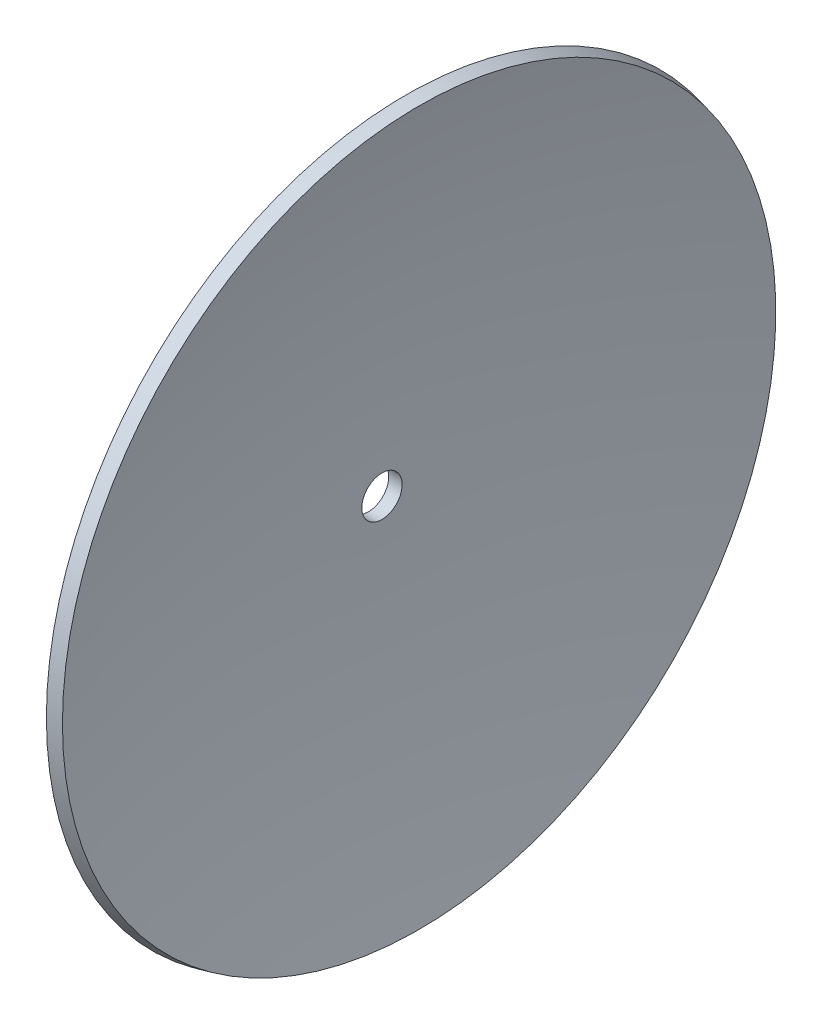
ISO-10303-21;
HEADER;
FILE_DESCRIPTION(('STEP AP214'),'2;1');
FILE_NAME('part.step','',(''),(''),'','','');
FILE_SCHEMA(('AUTOMOTIVE_DESIGN { 1 0 10303 214 1 1 1 1 }'));
ENDSEC;
DATA;
#1=APPLICATION_CONTEXT('core data for automotive mechanical design processes');
#2=APPLICATION_PROTOCOL_DEFINITION('international standard','automotive_design',2000,#1);
#3=PRODUCT_CONTEXT('',#1,'mechanical');
#4=PRODUCT('Part','Part','',(#3));
#5=PRODUCT_RELATED_PRODUCT_CATEGORY('part','',(#4));
#6=PRODUCT_DEFINITION_FORMATION('','',#4);
#7=PRODUCT_DEFINITION_CONTEXT('part definition',#1,'design');
#8=PRODUCT_DEFINITION('design','',#6,#7);
#9=PRODUCT_DEFINITION_SHAPE('','',#8);
#10=(LENGTH_UNIT() NAMED_UNIT(*) SI_UNIT(.MILLI.,.METRE.));
#11=(NAMED_UNIT(*) PLANE_ANGLE_UNIT() SI_UNIT($,.RADIAN.));
#12=(NAMED_UNIT(*) SI_UNIT($,.STERADIAN.) SOLID_ANGLE_UNIT());
#13=UNCERTAINTY_MEASURE_WITH_UNIT(LENGTH_MEASURE(1.E-05),#10,'distance_accuracy_value','');
#14=(GEOMETRIC_REPRESENTATION_CONTEXT(3) GLOBAL_UNCERTAINTY_ASSIGNED_CONTEXT((#13)) GLOBAL_UNIT_ASSIGNED_CONTEXT((#10,
#11,#12)) REPRESENTATION_CONTEXT('',''));
#15=CARTESIAN_POINT('',(0.,0.,0.));
#16=DIRECTION('',(0.,0.,1.));
#17=DIRECTION('',(1.,0.,0.));
#18=AXIS2_PLACEMENT_3D('',#15,#16,#17);
#19=CARTESIAN_POINT('',(-0.999999893161369,0.,1.49953774763293));
#20=CARTESIAN_POINT('',(-1.00012147521274,0.,1.76255865794094));
#21=CARTESIAN_POINT('',(-0.999660622967789,0.,2.02951466190819));
#22=CARTESIAN_POINT('',(-0.996581072873278,0.,2.5602086569357));
#23=CARTESIAN_POINT('',(-0.994113933771524,0.,2.82553079561031));
#24=CARTESIAN_POINT('',(-0.983968763404616,0.,3.62143356569755));
#25=CARTESIAN_POINT('',(-0.973541570190698,0.,4.15199765140914));
#26=CARTESIAN_POINT('',(-0.931226841468682,0.,5.74342520887701));
#27=CARTESIAN_POINT('',(-0.88830387688727,0.,6.80399348510013));
#28=CARTESIAN_POINT('',(-0.715395644383222,0.,9.98331156929495));
#29=CARTESIAN_POINT('',(-0.541246688648949,0.,12.0996880174529));
#30=CARTESIAN_POINT('',(-0.0754096879843496,0.,16.3195135460177));
#31=CARTESIAN_POINT('',(0.216277690704154,0.,18.4229514263009));
#32=CARTESIAN_POINT('',(0.741347709852542,0.,21.5634718626677));
#33=CARTESIAN_POINT('',(0.93095660201581,0.,22.6078755002206));
#34=CARTESIAN_POINT('',(1.2371324751598,0.,24.1702097121751));
#35=CARTESIAN_POINT('',(1.34281842799204,0.,24.6902793578322));
#36=CARTESIAN_POINT('',(1.50676734358068,0.,25.4692319083557));
#37=CARTESIAN_POINT('',(1.56231457517915,0.,25.7286845914899));
#38=CARTESIAN_POINT('',(1.67524634770966,0.,26.2472679045582));
#39=CARTESIAN_POINT('',(1.73312623366643,0.,26.5079009919417));
#40=CARTESIAN_POINT('',(1.79071268700014,0.,26.7645404573601));
#41=B_SPLINE_CURVE_WITH_KNOTS('',3,(#19,#20,#21,#22,#23,#24,#25,#26,#27,#28,#29,#30,#31,#32,#33,
#34,#35,#36,#37,#38,#39,#40),.UNSPECIFIED.,.F.,.F.,(4,2,2,2,2,2,2,2,2,2,4),(0.,0.03125,0.0625,
0.125,0.25,0.5,0.750000000000001,0.875000000000001,0.937500000000001,0.96875,1.),.UNSPECIFIED.);
#42=CARTESIAN_POINT('',(0.,0.,0.));
#43=DIRECTION('',(-1.,0.,0.));
#44=AXIS1_PLACEMENT('',#42,#43);
#45=SURFACE_OF_REVOLUTION('',#41,#44);
#46=CARTESIAN_POINT('',(1.79071268700014,0.,0.));
#47=DIRECTION('',(-1.,0.,0.));
#48=DIRECTION('',(0.,0.,1.));
#49=AXIS2_PLACEMENT_3D('',#46,#47,#48);
#50=CIRCLE('',#49,26.7645404573601);
#51=CARTESIAN_POINT('',(1.79071268700014,0.,26.7645404573601));
#52=VERTEX_POINT('',#51);
#53=EDGE_CURVE('E52',#52,#52,#50,.T.);
#54=ORIENTED_EDGE('',*,*,#53,.T.);
#55=EDGE_LOOP('',(#54));
#56=FACE_BOUND('',#55,.T.);
#57=CARTESIAN_POINT('',(-0.999999893161369,0.,0.));
#58=DIRECTION('',(-1.,0.,0.));
#59=DIRECTION('',(0.,0.,1.));
#60=AXIS2_PLACEMENT_3D('',#57,#58,#59);
#61=CIRCLE('',#60,1.49953774763293);
#62=CARTESIAN_POINT('',(-0.999999893161369,0.,1.49953774763293));
#63=VERTEX_POINT('',#62);
#64=EDGE_CURVE('E10',#63,#63,#61,.T.);
#65=ORIENTED_EDGE('',*,*,#64,.F.);
#66=EDGE_LOOP('',(#65));
#67=FACE_BOUND('',#66,.T.);
#68=ADVANCED_FACE('F37',(#56,#67),#45,.F.);
#69=CARTESIAN_POINT('',(-0.999999893161369,0.,0.));
#70=DIRECTION('',(1.,0.,0.));
#71=DIRECTION('',(0.,0.,-1.));
#72=AXIS2_PLACEMENT_3D('',#69,#70,#71);
#73=CONICAL_SURFACE('',#72,1.49953774763293,0.000462252383529821);
#74=CARTESIAN_POINT('',(0.,0.,0.));
#75=DIRECTION('',(-1.,0.,0.));
#76=DIRECTION('',(0.,0.,1.));
#77=AXIS2_PLACEMENT_3D('',#74,#75,#76);
#78=CIRCLE('',#77,1.5);
#79=CARTESIAN_POINT('',(0.,0.,1.5));
#80=VERTEX_POINT('',#79);
#81=EDGE_CURVE('E44',#80,#80,#78,.T.);
#82=ORIENTED_EDGE('',*,*,#81,.F.);
#83=EDGE_LOOP('',(#82));
#84=FACE_BOUND('',#83,.T.);
#85=ORIENTED_EDGE('',*,*,#64,.T.);
#86=EDGE_LOOP('',(#85));
#87=FACE_BOUND('',#86,.T.);
#88=ADVANCED_FACE('F71',(#84,#87),#73,.F.);
#89=CARTESIAN_POINT('',(0.,0.,1.5));
#90=CARTESIAN_POINT('',(-3.8521045977927E-05,0.,1.58333335772135));
#91=CARTESIAN_POINT('',(-0.00011556313793378,0.,1.75000007316405));
#92=CARTESIAN_POINT('',(0.000463002551735112,0.,1.99999970734361));
#93=CARTESIAN_POINT('',(0.00227473563741343,0.,2.41666269304153));
#94=CARTESIAN_POINT('',(0.0103245776103613,0.,3.33329931178601));
#95=CARTESIAN_POINT('',(0.0645458688658775,0.,6.08284580177894));
#96=CARTESIAN_POINT('',(0.262015291265119,0.,9.82884515484278));
#97=CARTESIAN_POINT('',(0.686732613057844,0.,14.3093768763231));
#98=CARTESIAN_POINT('',(1.18946965223475,0.,18.1942600259114));
#99=CARTESIAN_POINT('',(1.77461425456605,0.,21.7300617466758));
#100=CARTESIAN_POINT('',(2.24006841194015,0.,24.1016630316028));
#101=CARTESIAN_POINT('',(2.49836428628516,0.,25.324688572924));
#102=CARTESIAN_POINT('',(2.58625626656193,0.,25.73198092103));
#103=CARTESIAN_POINT('',(2.65766130472975,0.,26.0575766379572));
#104=CARTESIAN_POINT('',(2.71171481846189,0.,26.3016634494183));
#105=CARTESIAN_POINT('',(2.74820524433671,0.,26.4642864770102));
#106=CARTESIAN_POINT('',(2.76645045727412,0.,26.5455979908061));
#107=B_SPLINE_CURVE_WITH_KNOTS('',3,(#89,#90,#91,#92,#93,#94,#95,#96,#97,#98,#99,#100,#101,#102,
#103,#104,#105,#106),.UNSPECIFIED.,.F.,.F.,(4,1,1,1,1,1,1,1,1,1,1,1,1,1,1,4),(0.,
0.00990099009900997,0.0198019801980198,0.0297029702970296,0.0594059405940595,0.128712871287129,
0.356435643564359,0.504950495049507,0.663366336633663,0.821782178217822,0.930693069306932,
0.950495049504951,0.970297029702972,0.980198019801979,0.990099009900992,1.),.UNSPECIFIED.);
#108=CARTESIAN_POINT('',(0.,0.,0.));
#109=DIRECTION('',(-1.,0.,0.));
#110=AXIS1_PLACEMENT('',#108,#109);
#111=SURFACE_OF_REVOLUTION('',#107,#110);
#112=CARTESIAN_POINT('',(2.76645045727412,0.,0.));
#113=DIRECTION('',(-1.,0.,0.));
#114=DIRECTION('',(0.,0.,1.));
#115=AXIS2_PLACEMENT_3D('',#112,#113,#114);
#116=CIRCLE('',#115,26.5455979908061);
#117=CARTESIAN_POINT('',(2.76645045727412,0.,26.5455979908061));
#118=VERTEX_POINT('',#117);
#119=EDGE_CURVE('E48',#118,#118,#116,.T.);
#120=ORIENTED_EDGE('',*,*,#119,.F.);
#121=EDGE_LOOP('',(#120));
#122=FACE_BOUND('',#121,.T.);
#123=ORIENTED_EDGE('',*,*,#81,.T.);
#124=EDGE_LOOP('',(#123));
#125=FACE_BOUND('',#124,.T.);
#126=ADVANCED_FACE('F67',(#122,#125),#111,.T.);
#127=CARTESIAN_POINT('',(2.76645045727412,0.,0.));
#128=DIRECTION('',(-1.,0.,0.));
#129=DIRECTION('',(0.,0.,1.));
#130=AXIS2_PLACEMENT_3D('',#127,#128,#129);
#131=CONICAL_SURFACE('',#130,26.5455979908061,0.220730508892526);
#132=ORIENTED_EDGE('',*,*,#53,.F.);
#133=EDGE_LOOP('',(#132));
#134=FACE_BOUND('',#133,.T.);
#135=ORIENTED_EDGE('',*,*,#119,.T.);
#136=EDGE_LOOP('',(#135));
#137=FACE_BOUND('',#136,.T.);
#138=ADVANCED_FACE('F70',(#134,#137),#131,.T.);
#139=CLOSED_SHELL('',(#68,#88,#126,#138));
#140=MANIFOLD_SOLID_BREP('B2',#139);
#141=ADVANCED_BREP_SHAPE_REPRESENTATION('',(#18,#140),#14);
#142=SHAPE_DEFINITION_REPRESENTATION(#9,#141);
ENDSEC;
END-ISO-10303-21;
